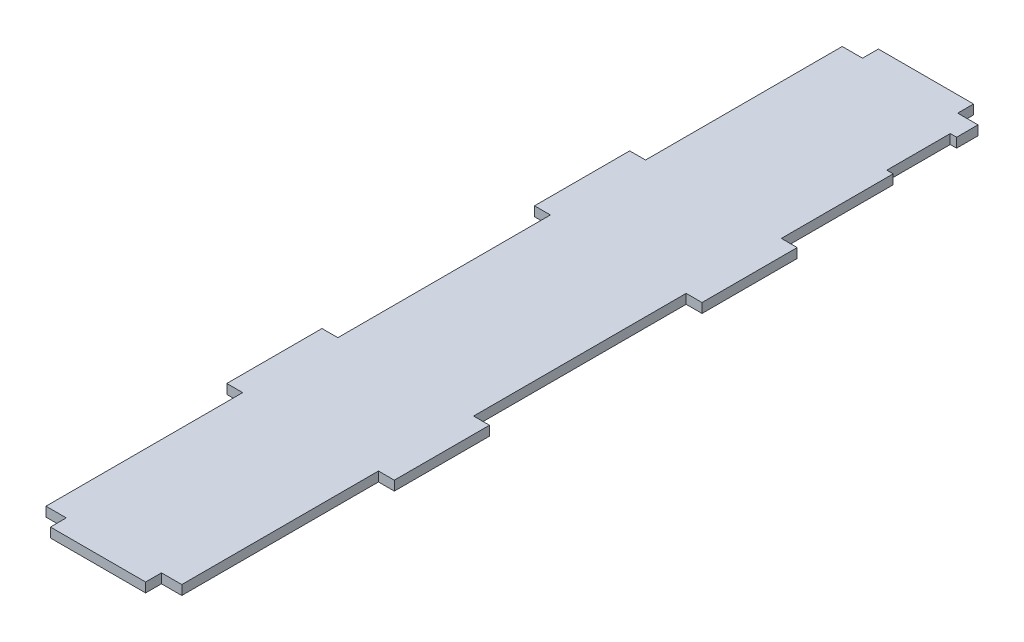
ISO-10303-21;
HEADER;
FILE_DESCRIPTION(('STEP AP214'),'2;1');
FILE_NAME('part.step','',(''),(''),'','','');
FILE_SCHEMA(('AUTOMOTIVE_DESIGN { 1 0 10303 214 1 1 1 1 }'));
ENDSEC;
DATA;
#1=APPLICATION_CONTEXT('core data for automotive mechanical design processes');
#2=APPLICATION_PROTOCOL_DEFINITION('international standard','automotive_design',2000,#1);
#3=PRODUCT_CONTEXT('',#1,'mechanical');
#4=PRODUCT('Part','Part','',(#3));
#5=PRODUCT_RELATED_PRODUCT_CATEGORY('part','',(#4));
#6=PRODUCT_DEFINITION_FORMATION('','',#4);
#7=PRODUCT_DEFINITION_CONTEXT('part definition',#1,'design');
#8=PRODUCT_DEFINITION('design','',#6,#7);
#9=PRODUCT_DEFINITION_SHAPE('','',#8);
#10=(LENGTH_UNIT() NAMED_UNIT(*) SI_UNIT(.MILLI.,.METRE.));
#11=(NAMED_UNIT(*) PLANE_ANGLE_UNIT() SI_UNIT($,.RADIAN.));
#12=(NAMED_UNIT(*) SI_UNIT($,.STERADIAN.) SOLID_ANGLE_UNIT());
#13=UNCERTAINTY_MEASURE_WITH_UNIT(LENGTH_MEASURE(1.E-05),#10,'distance_accuracy_value','');
#14=(GEOMETRIC_REPRESENTATION_CONTEXT(3) GLOBAL_UNCERTAINTY_ASSIGNED_CONTEXT((#13)) GLOBAL_UNIT_ASSIGNED_CONTEXT((#10,
#11,#12)) REPRESENTATION_CONTEXT('',''));
#15=CARTESIAN_POINT('',(0.,0.,0.));
#16=DIRECTION('',(0.,0.,1.));
#17=DIRECTION('',(1.,0.,0.));
#18=AXIS2_PLACEMENT_3D('',#15,#16,#17);
#19=CARTESIAN_POINT('',(21.4,0.,-63.5));
#20=DIRECTION('',(1.,0.,0.));
#21=DIRECTION('',(0.,0.,-1.));
#22=AXIS2_PLACEMENT_3D('',#19,#20,#21);
#23=PLANE('',#22);
#24=DIRECTION('',(0.,1.,0.));
#25=VECTOR('',#24,1.);
#26=CARTESIAN_POINT('',(21.4,0.,-118.75));
#27=LINE('',#26,#25);
#28=CARTESIAN_POINT('',(21.4,0.,-118.75));
#29=VERTEX_POINT('',#28);
#30=CARTESIAN_POINT('',(21.4,3.,-118.75));
#31=VERTEX_POINT('',#30);
#32=EDGE_CURVE('E278',#29,#31,#27,.T.);
#33=ORIENTED_EDGE('',*,*,#32,.F.);
#34=DIRECTION('',(0.,0.,-1.));
#35=VECTOR('',#34,1.);
#36=CARTESIAN_POINT('',(21.4,0.,-63.5));
#37=LINE('',#36,#35);
#38=CARTESIAN_POINT('',(21.4,0.,-125.5));
#39=VERTEX_POINT('',#38);
#40=EDGE_CURVE('E344',#29,#39,#37,.T.);
#41=ORIENTED_EDGE('',*,*,#40,.T.);
#42=DIRECTION('',(0.,1.,0.));
#43=VECTOR('',#42,1.);
#44=CARTESIAN_POINT('',(21.4,0.,-125.5));
#45=LINE('',#44,#43);
#46=CARTESIAN_POINT('',(21.4,3.,-125.5));
#47=VERTEX_POINT('',#46);
#48=EDGE_CURVE('E365',#39,#47,#45,.T.);
#49=ORIENTED_EDGE('',*,*,#48,.T.);
#50=DIRECTION('',(0.,0.,-1.));
#51=VECTOR('',#50,1.);
#52=CARTESIAN_POINT('',(21.4,3.,-63.5));
#53=LINE('',#52,#51);
#54=EDGE_CURVE('E355',#31,#47,#53,.T.);
#55=ORIENTED_EDGE('',*,*,#54,.F.);
#56=EDGE_LOOP('',(#33,#41,#49,#55));
#57=FACE_BOUND('',#56,.T.);
#58=ADVANCED_FACE('F37',(#57),#23,.T.);
#59=CARTESIAN_POINT('',(26.4,3.,130.5));
#60=DIRECTION('',(0.,0.,-1.));
#61=DIRECTION('',(-1.,0.,0.));
#62=AXIS2_PLACEMENT_3D('',#59,#60,#61);
#63=PLANE('',#62);
#64=DIRECTION('',(0.,1.,0.));
#65=VECTOR('',#64,1.);
#66=CARTESIAN_POINT('',(15.,0.,130.5));
#67=LINE('',#66,#65);
#68=CARTESIAN_POINT('',(15.,0.,130.5));
#69=VERTEX_POINT('',#68);
#70=CARTESIAN_POINT('',(15.,3.,130.5));
#71=VERTEX_POINT('',#70);
#72=EDGE_CURVE('E303',#69,#71,#67,.T.);
#73=ORIENTED_EDGE('',*,*,#72,.T.);
#74=DIRECTION('',(1.,0.,0.));
#75=VECTOR('',#74,1.);
#76=CARTESIAN_POINT('',(26.4,3.,130.5));
#77=LINE('',#76,#75);
#78=CARTESIAN_POINT('',(-15.,3.,130.5));
#79=VERTEX_POINT('',#78);
#80=EDGE_CURVE('E470',#79,#71,#77,.T.);
#81=ORIENTED_EDGE('',*,*,#80,.F.);
#82=DIRECTION('',(0.,1.,0.));
#83=VECTOR('',#82,1.);
#84=CARTESIAN_POINT('',(-15.,0.,130.5));
#85=LINE('',#84,#83);
#86=CARTESIAN_POINT('',(-15.,0.,130.5));
#87=VERTEX_POINT('',#86);
#88=EDGE_CURVE('E384',#87,#79,#85,.T.);
#89=ORIENTED_EDGE('',*,*,#88,.F.);
#90=DIRECTION('',(1.,0.,0.));
#91=VECTOR('',#90,1.);
#92=CARTESIAN_POINT('',(26.4,0.,130.5));
#93=LINE('',#92,#91);
#94=EDGE_CURVE('E479',#87,#69,#93,.T.);
#95=ORIENTED_EDGE('',*,*,#94,.T.);
#96=EDGE_LOOP('',(#73,#81,#89,#95));
#97=FACE_BOUND('',#96,.T.);
#98=ADVANCED_FACE('F565',(#97),#63,.F.);
#99=CARTESIAN_POINT('',(26.4,3.,130.5));
#100=DIRECTION('',(-1.,0.,0.));
#101=DIRECTION('',(0.,0.,1.));
#102=AXIS2_PLACEMENT_3D('',#99,#100,#101);
#103=PLANE('',#102);
#104=DIRECTION('',(0.,1.,0.));
#105=VECTOR('',#104,1.);
#106=CARTESIAN_POINT('',(26.4,0.,63.5));
#107=LINE('',#106,#105);
#108=CARTESIAN_POINT('',(26.4,0.,63.5));
#109=VERTEX_POINT('',#108);
#110=CARTESIAN_POINT('',(26.4,3.,63.5));
#111=VERTEX_POINT('',#110);
#112=EDGE_CURVE('E290',#109,#111,#107,.T.);
#113=ORIENTED_EDGE('',*,*,#112,.F.);
#114=DIRECTION('',(0.,0.,-1.));
#115=VECTOR('',#114,1.);
#116=CARTESIAN_POINT('',(26.4,0.,130.5));
#117=LINE('',#116,#115);
#118=CARTESIAN_POINT('',(26.4,0.,33.5));
#119=VERTEX_POINT('',#118);
#120=EDGE_CURVE('E483',#109,#119,#117,.T.);
#121=ORIENTED_EDGE('',*,*,#120,.T.);
#122=DIRECTION('',(0.,1.,0.));
#123=VECTOR('',#122,1.);
#124=CARTESIAN_POINT('',(26.4,0.,33.5));
#125=LINE('',#124,#123);
#126=CARTESIAN_POINT('',(26.4,3.,33.5));
#127=VERTEX_POINT('',#126);
#128=EDGE_CURVE('E295',#119,#127,#125,.T.);
#129=ORIENTED_EDGE('',*,*,#128,.T.);
#130=DIRECTION('',(0.,0.,-1.));
#131=VECTOR('',#130,1.);
#132=CARTESIAN_POINT('',(26.4,3.,130.5));
#133=LINE('',#132,#131);
#134=EDGE_CURVE('E46',#111,#127,#133,.T.);
#135=ORIENTED_EDGE('',*,*,#134,.F.);
#136=EDGE_LOOP('',(#113,#121,#129,#135));
#137=FACE_BOUND('',#136,.T.);
#138=ADVANCED_FACE('F546',(#137),#103,.F.);
#139=DIRECTION('',(0.,1.,0.));
#140=VECTOR('',#139,1.);
#141=CARTESIAN_POINT('',(26.4,0.,-33.5));
#142=LINE('',#141,#140);
#143=CARTESIAN_POINT('',(26.4,0.,-33.5));
#144=VERTEX_POINT('',#143);
#145=CARTESIAN_POINT('',(26.4,3.,-33.5));
#146=VERTEX_POINT('',#145);
#147=EDGE_CURVE('E321',#144,#146,#142,.T.);
#148=ORIENTED_EDGE('',*,*,#147,.F.);
#149=CARTESIAN_POINT('',(26.4,0.,-63.5));
#150=VERTEX_POINT('',#149);
#151=EDGE_CURVE('E481',#144,#150,#117,.T.);
#152=ORIENTED_EDGE('',*,*,#151,.T.);
#153=DIRECTION('',(0.,1.,0.));
#154=VECTOR('',#153,1.);
#155=CARTESIAN_POINT('',(26.4,0.,-63.5));
#156=LINE('',#155,#154);
#157=CARTESIAN_POINT('',(26.4,3.,-63.5));
#158=VERTEX_POINT('',#157);
#159=EDGE_CURVE('E326',#150,#158,#156,.T.);
#160=ORIENTED_EDGE('',*,*,#159,.T.);
#161=EDGE_CURVE('E473',#146,#158,#133,.T.);
#162=ORIENTED_EDGE('',*,*,#161,.F.);
#163=EDGE_LOOP('',(#148,#152,#160,#162));
#164=FACE_BOUND('',#163,.T.);
#165=ADVANCED_FACE('F532',(#164),#103,.F.);
#166=CARTESIAN_POINT('',(26.4,3.,-130.5));
#167=DIRECTION('',(0.,0.,1.));
#168=DIRECTION('',(1.,0.,0.));
#169=AXIS2_PLACEMENT_3D('',#166,#167,#168);
#170=PLANE('',#169);
#171=DIRECTION('',(0.,1.,0.));
#172=VECTOR('',#171,1.);
#173=CARTESIAN_POINT('',(15.,0.,-130.5));
#174=LINE('',#173,#172);
#175=CARTESIAN_POINT('',(15.,0.,-130.5));
#176=VERTEX_POINT('',#175);
#177=CARTESIAN_POINT('',(15.,3.,-130.5));
#178=VERTEX_POINT('',#177);
#179=EDGE_CURVE('E349',#176,#178,#174,.T.);
#180=ORIENTED_EDGE('',*,*,#179,.F.);
#181=DIRECTION('',(-1.,0.,0.));
#182=VECTOR('',#181,1.);
#183=CARTESIAN_POINT('',(26.4,0.,-130.5));
#184=LINE('',#183,#182);
#185=CARTESIAN_POINT('',(-15.,0.,-130.5));
#186=VERTEX_POINT('',#185);
#187=EDGE_CURVE('E41',#176,#186,#184,.T.);
#188=ORIENTED_EDGE('',*,*,#187,.T.);
#189=DIRECTION('',(0.,1.,0.));
#190=VECTOR('',#189,1.);
#191=CARTESIAN_POINT('',(-15.,0.,-130.5));
#192=LINE('',#191,#190);
#193=CARTESIAN_POINT('',(-15.,3.,-130.5));
#194=VERTEX_POINT('',#193);
#195=EDGE_CURVE('E306',#186,#194,#192,.T.);
#196=ORIENTED_EDGE('',*,*,#195,.T.);
#197=DIRECTION('',(-1.,0.,0.));
#198=VECTOR('',#197,1.);
#199=CARTESIAN_POINT('',(26.4,3.,-130.5));
#200=LINE('',#199,#198);
#201=EDGE_CURVE('E11',#178,#194,#200,.T.);
#202=ORIENTED_EDGE('',*,*,#201,.F.);
#203=EDGE_LOOP('',(#180,#188,#196,#202));
#204=FACE_BOUND('',#203,.T.);
#205=ADVANCED_FACE('F495',(#204),#170,.F.);
#206=CARTESIAN_POINT('',(0.,3.,0.));
#207=DIRECTION('',(0.,1.,0.));
#208=DIRECTION('',(0.,0.,1.));
#209=AXIS2_PLACEMENT_3D('',#206,#207,#208);
#210=PLANE('',#209);
#211=DIRECTION('',(-1.,0.,0.));
#212=VECTOR('',#211,1.);
#213=CARTESIAN_POINT('',(21.4,3.,-118.75));
#214=LINE('',#213,#212);
#215=CARTESIAN_POINT('',(19.4,3.,-118.75));
#216=VERTEX_POINT('',#215);
#217=EDGE_CURVE('E267',#31,#216,#214,.T.);
#218=ORIENTED_EDGE('',*,*,#217,.F.);
#219=ORIENTED_EDGE('',*,*,#54,.T.);
#220=DIRECTION('',(-1.,0.,0.));
#221=VECTOR('',#220,1.);
#222=CARTESIAN_POINT('',(21.4,3.,-125.5));
#223=LINE('',#222,#221);
#224=CARTESIAN_POINT('',(15.,3.,-125.5));
#225=VERTEX_POINT('',#224);
#226=EDGE_CURVE('E352',#47,#225,#223,.T.);
#227=ORIENTED_EDGE('',*,*,#226,.T.);
#228=DIRECTION('',(0.,0.,-1.));
#229=VECTOR('',#228,1.);
#230=CARTESIAN_POINT('',(15.,3.,-125.5));
#231=LINE('',#230,#229);
#232=EDGE_CURVE('E277',#225,#178,#231,.T.);
#233=ORIENTED_EDGE('',*,*,#232,.T.);
#234=ORIENTED_EDGE('',*,*,#201,.T.);
#235=DIRECTION('',(0.,0.,-1.));
#236=VECTOR('',#235,1.);
#237=CARTESIAN_POINT('',(-15.,3.,-125.5));
#238=LINE('',#237,#236);
#239=CARTESIAN_POINT('',(-15.,3.,-125.5));
#240=VERTEX_POINT('',#239);
#241=EDGE_CURVE('E444',#240,#194,#238,.T.);
#242=ORIENTED_EDGE('',*,*,#241,.F.);
#243=DIRECTION('',(1.,0.,0.));
#244=VECTOR('',#243,1.);
#245=CARTESIAN_POINT('',(-21.4,3.,-125.5));
#246=LINE('',#245,#244);
#247=CARTESIAN_POINT('',(-21.4,3.,-125.5));
#248=VERTEX_POINT('',#247);
#249=EDGE_CURVE('E447',#248,#240,#246,.T.);
#250=ORIENTED_EDGE('',*,*,#249,.F.);
#251=DIRECTION('',(0.,0.,-1.));
#252=VECTOR('',#251,1.);
#253=CARTESIAN_POINT('',(-21.4,3.,-63.5));
#254=LINE('',#253,#252);
#255=CARTESIAN_POINT('',(-21.4,3.,-63.5));
#256=VERTEX_POINT('',#255);
#257=EDGE_CURVE('E451',#256,#248,#254,.T.);
#258=ORIENTED_EDGE('',*,*,#257,.F.);
#259=DIRECTION('',(1.,0.,0.));
#260=VECTOR('',#259,1.);
#261=CARTESIAN_POINT('',(-26.4,3.,-63.5));
#262=LINE('',#261,#260);
#263=CARTESIAN_POINT('',(-26.4,3.,-63.5));
#264=VERTEX_POINT('',#263);
#265=EDGE_CURVE('E417',#264,#256,#262,.T.);
#266=ORIENTED_EDGE('',*,*,#265,.F.);
#267=DIRECTION('',(0.,0.,1.));
#268=VECTOR('',#267,1.);
#269=CARTESIAN_POINT('',(-26.4,3.,130.5));
#270=LINE('',#269,#268);
#271=CARTESIAN_POINT('',(-26.4,3.,-33.5));
#272=VERTEX_POINT('',#271);
#273=EDGE_CURVE('E469',#264,#272,#270,.T.);
#274=ORIENTED_EDGE('',*,*,#273,.T.);
#275=DIRECTION('',(-1.,0.,0.));
#276=VECTOR('',#275,1.);
#277=CARTESIAN_POINT('',(-26.4,3.,-33.5));
#278=LINE('',#277,#276);
#279=CARTESIAN_POINT('',(-21.4,3.,-33.5));
#280=VERTEX_POINT('',#279);
#281=EDGE_CURVE('E418',#280,#272,#278,.T.);
#282=ORIENTED_EDGE('',*,*,#281,.F.);
#283=DIRECTION('',(0.,0.,-1.));
#284=VECTOR('',#283,1.);
#285=CARTESIAN_POINT('',(-21.4,3.,33.5));
#286=LINE('',#285,#284);
#287=CARTESIAN_POINT('',(-21.4,3.,33.5));
#288=VERTEX_POINT('',#287);
#289=EDGE_CURVE('E420',#288,#280,#286,.T.);
#290=ORIENTED_EDGE('',*,*,#289,.F.);
#291=DIRECTION('',(1.,0.,0.));
#292=VECTOR('',#291,1.);
#293=CARTESIAN_POINT('',(-26.4,3.,33.5));
#294=LINE('',#293,#292);
#295=CARTESIAN_POINT('',(-26.4,3.,33.5));
#296=VERTEX_POINT('',#295);
#297=EDGE_CURVE('E389',#296,#288,#294,.T.);
#298=ORIENTED_EDGE('',*,*,#297,.F.);
#299=CARTESIAN_POINT('',(-26.4,3.,63.5));
#300=VERTEX_POINT('',#299);
#301=EDGE_CURVE('E466',#296,#300,#270,.T.);
#302=ORIENTED_EDGE('',*,*,#301,.T.);
#303=DIRECTION('',(-1.,0.,0.));
#304=VECTOR('',#303,1.);
#305=CARTESIAN_POINT('',(-26.4,3.,63.5));
#306=LINE('',#305,#304);
#307=CARTESIAN_POINT('',(-21.4,3.,63.5));
#308=VERTEX_POINT('',#307);
#309=EDGE_CURVE('E375',#308,#300,#306,.T.);
#310=ORIENTED_EDGE('',*,*,#309,.F.);
#311=DIRECTION('',(0.,0.,-1.));
#312=VECTOR('',#311,1.);
#313=CARTESIAN_POINT('',(-21.4,3.,63.5));
#314=LINE('',#313,#312);
#315=CARTESIAN_POINT('',(-21.4,3.,125.5));
#316=VERTEX_POINT('',#315);
#317=EDGE_CURVE('E392',#316,#308,#314,.T.);
#318=ORIENTED_EDGE('',*,*,#317,.F.);
#319=DIRECTION('',(-1.,0.,0.));
#320=VECTOR('',#319,1.);
#321=CARTESIAN_POINT('',(-21.4,3.,125.5));
#322=LINE('',#321,#320);
#323=CARTESIAN_POINT('',(-15.,3.,125.5));
#324=VERTEX_POINT('',#323);
#325=EDGE_CURVE('E388',#324,#316,#322,.T.);
#326=ORIENTED_EDGE('',*,*,#325,.F.);
#327=DIRECTION('',(0.,0.,-1.));
#328=VECTOR('',#327,1.);
#329=CARTESIAN_POINT('',(-15.,3.,125.5));
#330=LINE('',#329,#328);
#331=EDGE_CURVE('E385',#79,#324,#330,.T.);
#332=ORIENTED_EDGE('',*,*,#331,.F.);
#333=ORIENTED_EDGE('',*,*,#80,.T.);
#334=DIRECTION('',(0.,0.,-1.));
#335=VECTOR('',#334,1.);
#336=CARTESIAN_POINT('',(15.,3.,125.5));
#337=LINE('',#336,#335);
#338=CARTESIAN_POINT('',(15.,3.,125.5));
#339=VERTEX_POINT('',#338);
#340=EDGE_CURVE('E284',#71,#339,#337,.T.);
#341=ORIENTED_EDGE('',*,*,#340,.T.);
#342=DIRECTION('',(1.,0.,0.));
#343=VECTOR('',#342,1.);
#344=CARTESIAN_POINT('',(21.4,3.,125.5));
#345=LINE('',#344,#343);
#346=CARTESIAN_POINT('',(21.4,3.,125.5));
#347=VERTEX_POINT('',#346);
#348=EDGE_CURVE('E298',#339,#347,#345,.T.);
#349=ORIENTED_EDGE('',*,*,#348,.T.);
#350=DIRECTION('',(0.,0.,-1.));
#351=VECTOR('',#350,1.);
#352=CARTESIAN_POINT('',(21.4,3.,63.5));
#353=LINE('',#352,#351);
#354=CARTESIAN_POINT('',(21.4,3.,63.5));
#355=VERTEX_POINT('',#354);
#356=EDGE_CURVE('E294',#347,#355,#353,.T.);
#357=ORIENTED_EDGE('',*,*,#356,.T.);
#358=DIRECTION('',(1.,0.,0.));
#359=VECTOR('',#358,1.);
#360=CARTESIAN_POINT('',(26.4,3.,63.5));
#361=LINE('',#360,#359);
#362=EDGE_CURVE('E291',#355,#111,#361,.T.);
#363=ORIENTED_EDGE('',*,*,#362,.T.);
#364=ORIENTED_EDGE('',*,*,#134,.T.);
#365=DIRECTION('',(-1.,0.,0.));
#366=VECTOR('',#365,1.);
#367=CARTESIAN_POINT('',(26.4,3.,33.5));
#368=LINE('',#367,#366);
#369=CARTESIAN_POINT('',(21.4,3.,33.5));
#370=VERTEX_POINT('',#369);
#371=EDGE_CURVE('E316',#127,#370,#368,.T.);
#372=ORIENTED_EDGE('',*,*,#371,.T.);
#373=DIRECTION('',(0.,0.,-1.));
#374=VECTOR('',#373,1.);
#375=CARTESIAN_POINT('',(21.4,3.,33.5));
#376=LINE('',#375,#374);
#377=CARTESIAN_POINT('',(21.4,3.,-33.5));
#378=VERTEX_POINT('',#377);
#379=EDGE_CURVE('E325',#370,#378,#376,.T.);
#380=ORIENTED_EDGE('',*,*,#379,.T.);
#381=DIRECTION('',(1.,0.,0.));
#382=VECTOR('',#381,1.);
#383=CARTESIAN_POINT('',(26.4,3.,-33.5));
#384=LINE('',#383,#382);
#385=EDGE_CURVE('E322',#378,#146,#384,.T.);
#386=ORIENTED_EDGE('',*,*,#385,.T.);
#387=ORIENTED_EDGE('',*,*,#161,.T.);
#388=DIRECTION('',(-1.,0.,0.));
#389=VECTOR('',#388,1.);
#390=CARTESIAN_POINT('',(26.4,3.,-63.5));
#391=LINE('',#390,#389);
#392=CARTESIAN_POINT('',(21.4,3.,-63.5));
#393=VERTEX_POINT('',#392);
#394=EDGE_CURVE('E341',#158,#393,#391,.T.);
#395=ORIENTED_EDGE('',*,*,#394,.T.);
#396=CARTESIAN_POINT('',(21.4,3.,-98.7500000000001));
#397=VERTEX_POINT('',#396);
#398=EDGE_CURVE('E356',#393,#397,#53,.T.);
#399=ORIENTED_EDGE('',*,*,#398,.T.);
#400=DIRECTION('',(1.,0.,0.));
#401=VECTOR('',#400,1.);
#402=CARTESIAN_POINT('',(21.4,3.,-98.7500000000001));
#403=LINE('',#402,#401);
#404=CARTESIAN_POINT('',(19.4,3.,-98.7500000000001));
#405=VERTEX_POINT('',#404);
#406=EDGE_CURVE('E54',#405,#397,#403,.T.);
#407=ORIENTED_EDGE('',*,*,#406,.F.);
#408=DIRECTION('',(0.,0.,1.));
#409=VECTOR('',#408,1.);
#410=CARTESIAN_POINT('',(19.4,3.,-98.7500000000001));
#411=LINE('',#410,#409);
#412=EDGE_CURVE('E254',#216,#405,#411,.T.);
#413=ORIENTED_EDGE('',*,*,#412,.F.);
#414=EDGE_LOOP('',(#218,#219,#227,#233,#234,#242,#250,#258,#266,#274,#282,#290,#298,#302,#310,
#318,#326,#332,#333,#341,#349,#357,#363,#364,#372,#380,#386,#387,#395,#399,#407,#413));
#415=FACE_BOUND('',#414,.T.);
#416=ADVANCED_FACE('F509',(#415),#210,.T.);
#417=CARTESIAN_POINT('',(0.,0.,0.));
#418=DIRECTION('',(0.,1.,0.));
#419=DIRECTION('',(0.,0.,1.));
#420=AXIS2_PLACEMENT_3D('',#417,#418,#419);
#421=PLANE('',#420);
#422=ORIENTED_EDGE('',*,*,#40,.F.);
#423=DIRECTION('',(-1.,0.,0.));
#424=VECTOR('',#423,1.);
#425=CARTESIAN_POINT('',(21.4,0.,-118.75));
#426=LINE('',#425,#424);
#427=CARTESIAN_POINT('',(19.4,0.,-118.75));
#428=VERTEX_POINT('',#427);
#429=EDGE_CURVE('E256',#29,#428,#426,.T.);
#430=ORIENTED_EDGE('',*,*,#429,.T.);
#431=DIRECTION('',(0.,0.,1.));
#432=VECTOR('',#431,1.);
#433=CARTESIAN_POINT('',(19.4,0.,-98.7500000000001));
#434=LINE('',#433,#432);
#435=CARTESIAN_POINT('',(19.4,0.,-98.7500000000001));
#436=VERTEX_POINT('',#435);
#437=EDGE_CURVE('E251',#428,#436,#434,.T.);
#438=ORIENTED_EDGE('',*,*,#437,.T.);
#439=DIRECTION('',(1.,0.,0.));
#440=VECTOR('',#439,1.);
#441=CARTESIAN_POINT('',(21.4,0.,-98.7500000000001));
#442=LINE('',#441,#440);
#443=CARTESIAN_POINT('',(21.4,0.,-98.7500000000001));
#444=VERTEX_POINT('',#443);
#445=EDGE_CURVE('E259',#436,#444,#442,.T.);
#446=ORIENTED_EDGE('',*,*,#445,.T.);
#447=CARTESIAN_POINT('',(21.4,0.,-63.5));
#448=VERTEX_POINT('',#447);
#449=EDGE_CURVE('E345',#448,#444,#37,.T.);
#450=ORIENTED_EDGE('',*,*,#449,.F.);
#451=DIRECTION('',(-1.,0.,0.));
#452=VECTOR('',#451,1.);
#453=CARTESIAN_POINT('',(26.4,0.,-63.5));
#454=LINE('',#453,#452);
#455=EDGE_CURVE('E347',#150,#448,#454,.T.);
#456=ORIENTED_EDGE('',*,*,#455,.F.);
#457=ORIENTED_EDGE('',*,*,#151,.F.);
#458=DIRECTION('',(1.,0.,0.));
#459=VECTOR('',#458,1.);
#460=CARTESIAN_POINT('',(26.4,0.,-33.5));
#461=LINE('',#460,#459);
#462=CARTESIAN_POINT('',(21.4,0.,-33.5));
#463=VERTEX_POINT('',#462);
#464=EDGE_CURVE('E313',#463,#144,#461,.T.);
#465=ORIENTED_EDGE('',*,*,#464,.F.);
#466=DIRECTION('',(0.,0.,-1.));
#467=VECTOR('',#466,1.);
#468=CARTESIAN_POINT('',(21.4,0.,33.5));
#469=LINE('',#468,#467);
#470=CARTESIAN_POINT('',(21.4,0.,33.5));
#471=VERTEX_POINT('',#470);
#472=EDGE_CURVE('E315',#471,#463,#469,.T.);
#473=ORIENTED_EDGE('',*,*,#472,.F.);
#474=DIRECTION('',(-1.,0.,0.));
#475=VECTOR('',#474,1.);
#476=CARTESIAN_POINT('',(26.4,0.,33.5));
#477=LINE('',#476,#475);
#478=EDGE_CURVE('E319',#119,#471,#477,.T.);
#479=ORIENTED_EDGE('',*,*,#478,.F.);
#480=ORIENTED_EDGE('',*,*,#120,.F.);
#481=DIRECTION('',(1.,0.,0.));
#482=VECTOR('',#481,1.);
#483=CARTESIAN_POINT('',(26.4,0.,63.5));
#484=LINE('',#483,#482);
#485=CARTESIAN_POINT('',(21.4,0.,63.5));
#486=VERTEX_POINT('',#485);
#487=EDGE_CURVE('E281',#486,#109,#484,.T.);
#488=ORIENTED_EDGE('',*,*,#487,.F.);
#489=DIRECTION('',(0.,0.,-1.));
#490=VECTOR('',#489,1.);
#491=CARTESIAN_POINT('',(21.4,0.,63.5));
#492=LINE('',#491,#490);
#493=CARTESIAN_POINT('',(21.4,0.,125.5));
#494=VERTEX_POINT('',#493);
#495=EDGE_CURVE('E283',#494,#486,#492,.T.);
#496=ORIENTED_EDGE('',*,*,#495,.F.);
#497=DIRECTION('',(1.,0.,0.));
#498=VECTOR('',#497,1.);
#499=CARTESIAN_POINT('',(21.4,0.,125.5));
#500=LINE('',#499,#498);
#501=CARTESIAN_POINT('',(15.,0.,125.5));
#502=VERTEX_POINT('',#501);
#503=EDGE_CURVE('E286',#502,#494,#500,.T.);
#504=ORIENTED_EDGE('',*,*,#503,.F.);
#505=DIRECTION('',(0.,0.,-1.));
#506=VECTOR('',#505,1.);
#507=CARTESIAN_POINT('',(15.,0.,125.5));
#508=LINE('',#507,#506);
#509=EDGE_CURVE('E288',#69,#502,#508,.T.);
#510=ORIENTED_EDGE('',*,*,#509,.F.);
#511=ORIENTED_EDGE('',*,*,#94,.F.);
#512=DIRECTION('',(0.,0.,-1.));
#513=VECTOR('',#512,1.);
#514=CARTESIAN_POINT('',(-15.,0.,125.5));
#515=LINE('',#514,#513);
#516=CARTESIAN_POINT('',(-15.,0.,125.5));
#517=VERTEX_POINT('',#516);
#518=EDGE_CURVE('E371',#87,#517,#515,.T.);
#519=ORIENTED_EDGE('',*,*,#518,.T.);
#520=DIRECTION('',(-1.,0.,0.));
#521=VECTOR('',#520,1.);
#522=CARTESIAN_POINT('',(-21.4,0.,125.5));
#523=LINE('',#522,#521);
#524=CARTESIAN_POINT('',(-21.4,0.,125.5));
#525=VERTEX_POINT('',#524);
#526=EDGE_CURVE('E374',#517,#525,#523,.T.);
#527=ORIENTED_EDGE('',*,*,#526,.T.);
#528=DIRECTION('',(0.,0.,-1.));
#529=VECTOR('',#528,1.);
#530=CARTESIAN_POINT('',(-21.4,0.,63.5));
#531=LINE('',#530,#529);
#532=CARTESIAN_POINT('',(-21.4,0.,63.5));
#533=VERTEX_POINT('',#532);
#534=EDGE_CURVE('E378',#525,#533,#531,.T.);
#535=ORIENTED_EDGE('',*,*,#534,.T.);
#536=DIRECTION('',(-1.,0.,0.));
#537=VECTOR('',#536,1.);
#538=CARTESIAN_POINT('',(-26.4,0.,63.5));
#539=LINE('',#538,#537);
#540=CARTESIAN_POINT('',(-26.4,0.,63.5));
#541=VERTEX_POINT('',#540);
#542=EDGE_CURVE('E381',#533,#541,#539,.T.);
#543=ORIENTED_EDGE('',*,*,#542,.T.);
#544=DIRECTION('',(0.,0.,1.));
#545=VECTOR('',#544,1.);
#546=CARTESIAN_POINT('',(-26.4,0.,130.5));
#547=LINE('',#546,#545);
#548=CARTESIAN_POINT('',(-26.4,0.,33.5));
#549=VERTEX_POINT('',#548);
#550=EDGE_CURVE('E399',#549,#541,#547,.T.);
#551=ORIENTED_EDGE('',*,*,#550,.F.);
#552=DIRECTION('',(1.,0.,0.));
#553=VECTOR('',#552,1.);
#554=CARTESIAN_POINT('',(-26.4,0.,33.5));
#555=LINE('',#554,#553);
#556=CARTESIAN_POINT('',(-21.4,0.,33.5));
#557=VERTEX_POINT('',#556);
#558=EDGE_CURVE('E421',#549,#557,#555,.T.);
#559=ORIENTED_EDGE('',*,*,#558,.T.);
#560=DIRECTION('',(0.,0.,-1.));
#561=VECTOR('',#560,1.);
#562=CARTESIAN_POINT('',(-21.4,0.,33.5));
#563=LINE('',#562,#561);
#564=CARTESIAN_POINT('',(-21.4,0.,-33.5));
#565=VERTEX_POINT('',#564);
#566=EDGE_CURVE('E428',#557,#565,#563,.T.);
#567=ORIENTED_EDGE('',*,*,#566,.T.);
#568=DIRECTION('',(-1.,0.,0.));
#569=VECTOR('',#568,1.);
#570=CARTESIAN_POINT('',(-26.4,0.,-33.5));
#571=LINE('',#570,#569);
#572=CARTESIAN_POINT('',(-26.4,0.,-33.5));
#573=VERTEX_POINT('',#572);
#574=EDGE_CURVE('E409',#565,#573,#571,.T.);
#575=ORIENTED_EDGE('',*,*,#574,.T.);
#576=CARTESIAN_POINT('',(-26.4,0.,-63.5));
#577=VERTEX_POINT('',#576);
#578=EDGE_CURVE('E478',#577,#573,#547,.T.);
#579=ORIENTED_EDGE('',*,*,#578,.F.);
#580=DIRECTION('',(1.,0.,0.));
#581=VECTOR('',#580,1.);
#582=CARTESIAN_POINT('',(-26.4,0.,-63.5));
#583=LINE('',#582,#581);
#584=CARTESIAN_POINT('',(-21.4,0.,-63.5));
#585=VERTEX_POINT('',#584);
#586=EDGE_CURVE('E448',#577,#585,#583,.T.);
#587=ORIENTED_EDGE('',*,*,#586,.T.);
#588=DIRECTION('',(0.,0.,-1.));
#589=VECTOR('',#588,1.);
#590=CARTESIAN_POINT('',(-21.4,0.,-63.5));
#591=LINE('',#590,#589);
#592=CARTESIAN_POINT('',(-21.4,0.,-125.5));
#593=VERTEX_POINT('',#592);
#594=EDGE_CURVE('E461',#585,#593,#591,.T.);
#595=ORIENTED_EDGE('',*,*,#594,.T.);
#596=DIRECTION('',(1.,0.,0.));
#597=VECTOR('',#596,1.);
#598=CARTESIAN_POINT('',(-21.4,0.,-125.5));
#599=LINE('',#598,#597);
#600=CARTESIAN_POINT('',(-15.,0.,-125.5));
#601=VERTEX_POINT('',#600);
#602=EDGE_CURVE('E458',#593,#601,#599,.T.);
#603=ORIENTED_EDGE('',*,*,#602,.T.);
#604=DIRECTION('',(0.,0.,-1.));
#605=VECTOR('',#604,1.);
#606=CARTESIAN_POINT('',(-15.,0.,-125.5));
#607=LINE('',#606,#605);
#608=EDGE_CURVE('E435',#601,#186,#607,.T.);
#609=ORIENTED_EDGE('',*,*,#608,.T.);
#610=ORIENTED_EDGE('',*,*,#187,.F.);
#611=DIRECTION('',(0.,0.,-1.));
#612=VECTOR('',#611,1.);
#613=CARTESIAN_POINT('',(15.,0.,-125.5));
#614=LINE('',#613,#612);
#615=CARTESIAN_POINT('',(15.,0.,-125.5));
#616=VERTEX_POINT('',#615);
#617=EDGE_CURVE('E338',#616,#176,#614,.T.);
#618=ORIENTED_EDGE('',*,*,#617,.F.);
#619=DIRECTION('',(-1.,0.,0.));
#620=VECTOR('',#619,1.);
#621=CARTESIAN_POINT('',(21.4,0.,-125.5));
#622=LINE('',#621,#620);
#623=EDGE_CURVE('E340',#39,#616,#622,.T.);
#624=ORIENTED_EDGE('',*,*,#623,.F.);
#625=EDGE_LOOP('',(#422,#430,#438,#446,#450,#456,#457,#465,#473,#479,#480,#488,#496,#504,#510,
#511,#519,#527,#535,#543,#551,#559,#567,#575,#579,#587,#595,#603,#609,#610,#618,#624));
#626=FACE_BOUND('',#625,.T.);
#627=ADVANCED_FACE('F266',(#626),#421,.F.);
#628=CARTESIAN_POINT('',(-26.4,3.,130.5));
#629=DIRECTION('',(1.,0.,0.));
#630=DIRECTION('',(0.,0.,-1.));
#631=AXIS2_PLACEMENT_3D('',#628,#629,#630);
#632=PLANE('',#631);
#633=ORIENTED_EDGE('',*,*,#578,.T.);
#634=DIRECTION('',(0.,1.,0.));
#635=VECTOR('',#634,1.);
#636=CARTESIAN_POINT('',(-26.4,0.,-33.5));
#637=LINE('',#636,#635);
#638=EDGE_CURVE('E414',#573,#272,#637,.T.);
#639=ORIENTED_EDGE('',*,*,#638,.T.);
#640=ORIENTED_EDGE('',*,*,#273,.F.);
#641=DIRECTION('',(0.,1.,0.));
#642=VECTOR('',#641,1.);
#643=CARTESIAN_POINT('',(-26.4,0.,-63.5));
#644=LINE('',#643,#642);
#645=EDGE_CURVE('E433',#577,#264,#644,.T.);
#646=ORIENTED_EDGE('',*,*,#645,.F.);
#647=EDGE_LOOP('',(#633,#639,#640,#646));
#648=FACE_BOUND('',#647,.T.);
#649=ADVANCED_FACE('F602',(#648),#632,.F.);
#650=ORIENTED_EDGE('',*,*,#550,.T.);
#651=DIRECTION('',(0.,1.,0.));
#652=VECTOR('',#651,1.);
#653=CARTESIAN_POINT('',(-26.4,0.,63.5));
#654=LINE('',#653,#652);
#655=EDGE_CURVE('E396',#541,#300,#654,.T.);
#656=ORIENTED_EDGE('',*,*,#655,.T.);
#657=ORIENTED_EDGE('',*,*,#301,.F.);
#658=DIRECTION('',(0.,1.,0.));
#659=VECTOR('',#658,1.);
#660=CARTESIAN_POINT('',(-26.4,0.,33.5));
#661=LINE('',#660,#659);
#662=EDGE_CURVE('E407',#549,#296,#661,.T.);
#663=ORIENTED_EDGE('',*,*,#662,.F.);
#664=EDGE_LOOP('',(#650,#656,#657,#663));
#665=FACE_BOUND('',#664,.T.);
#666=ADVANCED_FACE('F39',(#665),#632,.F.);
#667=CARTESIAN_POINT('',(-15.,0.,-125.5));
#668=DIRECTION('',(1.,0.,0.));
#669=DIRECTION('',(0.,0.,-1.));
#670=AXIS2_PLACEMENT_3D('',#667,#668,#669);
#671=PLANE('',#670);
#672=ORIENTED_EDGE('',*,*,#241,.T.);
#673=ORIENTED_EDGE('',*,*,#195,.F.);
#674=ORIENTED_EDGE('',*,*,#608,.F.);
#675=DIRECTION('',(0.,1.,0.));
#676=VECTOR('',#675,1.);
#677=CARTESIAN_POINT('',(-15.,0.,-125.5));
#678=LINE('',#677,#676);
#679=EDGE_CURVE('E440',#601,#240,#678,.T.);
#680=ORIENTED_EDGE('',*,*,#679,.T.);
#681=EDGE_LOOP('',(#672,#673,#674,#680));
#682=FACE_BOUND('',#681,.T.);
#683=ADVANCED_FACE('F500',(#682),#671,.F.);
#684=CARTESIAN_POINT('',(-21.4,0.,-125.5));
#685=DIRECTION('',(0.,0.,1.));
#686=DIRECTION('',(1.,0.,0.));
#687=AXIS2_PLACEMENT_3D('',#684,#685,#686);
#688=PLANE('',#687);
#689=ORIENTED_EDGE('',*,*,#249,.T.);
#690=ORIENTED_EDGE('',*,*,#679,.F.);
#691=ORIENTED_EDGE('',*,*,#602,.F.);
#692=DIRECTION('',(0.,1.,0.));
#693=VECTOR('',#692,1.);
#694=CARTESIAN_POINT('',(-21.4,0.,-125.5));
#695=LINE('',#694,#693);
#696=EDGE_CURVE('E438',#593,#248,#695,.T.);
#697=ORIENTED_EDGE('',*,*,#696,.T.);
#698=EDGE_LOOP('',(#689,#690,#691,#697));
#699=FACE_BOUND('',#698,.T.);
#700=ADVANCED_FACE('F504',(#699),#688,.F.);
#701=CARTESIAN_POINT('',(-21.4,0.,-63.5));
#702=DIRECTION('',(1.,0.,0.));
#703=DIRECTION('',(0.,0.,-1.));
#704=AXIS2_PLACEMENT_3D('',#701,#702,#703);
#705=PLANE('',#704);
#706=ORIENTED_EDGE('',*,*,#257,.T.);
#707=ORIENTED_EDGE('',*,*,#696,.F.);
#708=ORIENTED_EDGE('',*,*,#594,.F.);
#709=DIRECTION('',(0.,1.,0.));
#710=VECTOR('',#709,1.);
#711=CARTESIAN_POINT('',(-21.4,0.,-63.5));
#712=LINE('',#711,#710);
#713=EDGE_CURVE('E436',#585,#256,#712,.T.);
#714=ORIENTED_EDGE('',*,*,#713,.T.);
#715=EDGE_LOOP('',(#706,#707,#708,#714));
#716=FACE_BOUND('',#715,.T.);
#717=ADVANCED_FACE('F609',(#716),#705,.F.);
#718=CARTESIAN_POINT('',(-26.4,0.,-63.5));
#719=DIRECTION('',(0.,0.,1.));
#720=DIRECTION('',(1.,0.,0.));
#721=AXIS2_PLACEMENT_3D('',#718,#719,#720);
#722=PLANE('',#721);
#723=ORIENTED_EDGE('',*,*,#265,.T.);
#724=ORIENTED_EDGE('',*,*,#713,.F.);
#725=ORIENTED_EDGE('',*,*,#586,.F.);
#726=ORIENTED_EDGE('',*,*,#645,.T.);
#727=EDGE_LOOP('',(#723,#724,#725,#726));
#728=FACE_BOUND('',#727,.T.);
#729=ADVANCED_FACE('F607',(#728),#722,.F.);
#730=CARTESIAN_POINT('',(-26.4,0.,-33.5));
#731=DIRECTION('',(0.,0.,-1.));
#732=DIRECTION('',(-1.,0.,0.));
#733=AXIS2_PLACEMENT_3D('',#730,#731,#732);
#734=PLANE('',#733);
#735=ORIENTED_EDGE('',*,*,#281,.T.);
#736=ORIENTED_EDGE('',*,*,#638,.F.);
#737=ORIENTED_EDGE('',*,*,#574,.F.);
#738=DIRECTION('',(0.,1.,0.));
#739=VECTOR('',#738,1.);
#740=CARTESIAN_POINT('',(-21.4,0.,-33.5));
#741=LINE('',#740,#739);
#742=EDGE_CURVE('E412',#565,#280,#741,.T.);
#743=ORIENTED_EDGE('',*,*,#742,.T.);
#744=EDGE_LOOP('',(#735,#736,#737,#743));
#745=FACE_BOUND('',#744,.T.);
#746=ADVANCED_FACE('F598',(#745),#734,.F.);
#747=CARTESIAN_POINT('',(-21.4,0.,33.5));
#748=DIRECTION('',(1.,0.,0.));
#749=DIRECTION('',(0.,0.,-1.));
#750=AXIS2_PLACEMENT_3D('',#747,#748,#749);
#751=PLANE('',#750);
#752=ORIENTED_EDGE('',*,*,#289,.T.);
#753=ORIENTED_EDGE('',*,*,#742,.F.);
#754=ORIENTED_EDGE('',*,*,#566,.F.);
#755=DIRECTION('',(0.,1.,0.));
#756=VECTOR('',#755,1.);
#757=CARTESIAN_POINT('',(-21.4,0.,33.5));
#758=LINE('',#757,#756);
#759=EDGE_CURVE('E410',#557,#288,#758,.T.);
#760=ORIENTED_EDGE('',*,*,#759,.T.);
#761=EDGE_LOOP('',(#752,#753,#754,#760));
#762=FACE_BOUND('',#761,.T.);
#763=ADVANCED_FACE('F596',(#762),#751,.F.);
#764=CARTESIAN_POINT('',(-26.4,0.,33.5));
#765=DIRECTION('',(0.,0.,1.));
#766=DIRECTION('',(1.,0.,0.));
#767=AXIS2_PLACEMENT_3D('',#764,#765,#766);
#768=PLANE('',#767);
#769=ORIENTED_EDGE('',*,*,#297,.T.);
#770=ORIENTED_EDGE('',*,*,#759,.F.);
#771=ORIENTED_EDGE('',*,*,#558,.F.);
#772=ORIENTED_EDGE('',*,*,#662,.T.);
#773=EDGE_LOOP('',(#769,#770,#771,#772));
#774=FACE_BOUND('',#773,.T.);
#775=ADVANCED_FACE('F591',(#774),#768,.F.);
#776=CARTESIAN_POINT('',(-26.4,0.,63.5));
#777=DIRECTION('',(0.,0.,-1.));
#778=DIRECTION('',(-1.,0.,0.));
#779=AXIS2_PLACEMENT_3D('',#776,#777,#778);
#780=PLANE('',#779);
#781=ORIENTED_EDGE('',*,*,#309,.T.);
#782=ORIENTED_EDGE('',*,*,#655,.F.);
#783=ORIENTED_EDGE('',*,*,#542,.F.);
#784=DIRECTION('',(0.,1.,0.));
#785=VECTOR('',#784,1.);
#786=CARTESIAN_POINT('',(-21.4,0.,63.5));
#787=LINE('',#786,#785);
#788=EDGE_CURVE('E400',#533,#308,#787,.T.);
#789=ORIENTED_EDGE('',*,*,#788,.T.);
#790=EDGE_LOOP('',(#781,#782,#783,#789));
#791=FACE_BOUND('',#790,.T.);
#792=ADVANCED_FACE('F582',(#791),#780,.F.);
#793=CARTESIAN_POINT('',(-21.4,0.,63.5));
#794=DIRECTION('',(1.,0.,0.));
#795=DIRECTION('',(0.,0.,-1.));
#796=AXIS2_PLACEMENT_3D('',#793,#794,#795);
#797=PLANE('',#796);
#798=ORIENTED_EDGE('',*,*,#317,.T.);
#799=ORIENTED_EDGE('',*,*,#788,.F.);
#800=ORIENTED_EDGE('',*,*,#534,.F.);
#801=DIRECTION('',(0.,1.,0.));
#802=VECTOR('',#801,1.);
#803=CARTESIAN_POINT('',(-21.4,0.,125.5));
#804=LINE('',#803,#802);
#805=EDGE_CURVE('E402',#525,#316,#804,.T.);
#806=ORIENTED_EDGE('',*,*,#805,.T.);
#807=EDGE_LOOP('',(#798,#799,#800,#806));
#808=FACE_BOUND('',#807,.T.);
#809=ADVANCED_FACE('F580',(#808),#797,.F.);
#810=CARTESIAN_POINT('',(-21.4,0.,125.5));
#811=DIRECTION('',(0.,0.,-1.));
#812=DIRECTION('',(-1.,0.,0.));
#813=AXIS2_PLACEMENT_3D('',#810,#811,#812);
#814=PLANE('',#813);
#815=ORIENTED_EDGE('',*,*,#325,.T.);
#816=ORIENTED_EDGE('',*,*,#805,.F.);
#817=ORIENTED_EDGE('',*,*,#526,.F.);
#818=DIRECTION('',(0.,1.,0.));
#819=VECTOR('',#818,1.);
#820=CARTESIAN_POINT('',(-15.,0.,125.5));
#821=LINE('',#820,#819);
#822=EDGE_CURVE('E404',#517,#324,#821,.T.);
#823=ORIENTED_EDGE('',*,*,#822,.T.);
#824=EDGE_LOOP('',(#815,#816,#817,#823));
#825=FACE_BOUND('',#824,.T.);
#826=ADVANCED_FACE('F575',(#825),#814,.F.);
#827=CARTESIAN_POINT('',(-15.,0.,125.5));
#828=DIRECTION('',(1.,0.,0.));
#829=DIRECTION('',(0.,0.,-1.));
#830=AXIS2_PLACEMENT_3D('',#827,#828,#829);
#831=PLANE('',#830);
#832=ORIENTED_EDGE('',*,*,#331,.T.);
#833=ORIENTED_EDGE('',*,*,#822,.F.);
#834=ORIENTED_EDGE('',*,*,#518,.F.);
#835=ORIENTED_EDGE('',*,*,#88,.T.);
#836=EDGE_LOOP('',(#832,#833,#834,#835));
#837=FACE_BOUND('',#836,.T.);
#838=ADVANCED_FACE('F569',(#837),#831,.F.);
#839=CARTESIAN_POINT('',(26.4,0.,-63.5));
#840=DIRECTION('',(0.,0.,-1.));
#841=DIRECTION('',(-1.,0.,0.));
#842=AXIS2_PLACEMENT_3D('',#839,#840,#841);
#843=PLANE('',#842);
#844=ORIENTED_EDGE('',*,*,#394,.F.);
#845=ORIENTED_EDGE('',*,*,#159,.F.);
#846=ORIENTED_EDGE('',*,*,#455,.T.);
#847=DIRECTION('',(0.,1.,0.));
#848=VECTOR('',#847,1.);
#849=CARTESIAN_POINT('',(21.4,0.,-63.5));
#850=LINE('',#849,#848);
#851=EDGE_CURVE('E363',#448,#393,#850,.T.);
#852=ORIENTED_EDGE('',*,*,#851,.T.);
#853=EDGE_LOOP('',(#844,#845,#846,#852));
#854=FACE_BOUND('',#853,.T.);
#855=ADVANCED_FACE('F530',(#854),#843,.T.);
#856=DIRECTION('',(0.,1.,0.));
#857=VECTOR('',#856,1.);
#858=CARTESIAN_POINT('',(21.4,0.,-98.7500000000001));
#859=LINE('',#858,#857);
#860=EDGE_CURVE('E255',#444,#397,#859,.T.);
#861=ORIENTED_EDGE('',*,*,#860,.T.);
#862=ORIENTED_EDGE('',*,*,#398,.F.);
#863=ORIENTED_EDGE('',*,*,#851,.F.);
#864=ORIENTED_EDGE('',*,*,#449,.T.);
#865=EDGE_LOOP('',(#861,#862,#863,#864));
#866=FACE_BOUND('',#865,.T.);
#867=ADVANCED_FACE('F526',(#866),#23,.T.);
#868=CARTESIAN_POINT('',(21.4,0.,-125.5));
#869=DIRECTION('',(0.,0.,-1.));
#870=DIRECTION('',(-1.,0.,0.));
#871=AXIS2_PLACEMENT_3D('',#868,#869,#870);
#872=PLANE('',#871);
#873=ORIENTED_EDGE('',*,*,#226,.F.);
#874=ORIENTED_EDGE('',*,*,#48,.F.);
#875=ORIENTED_EDGE('',*,*,#623,.T.);
#876=DIRECTION('',(0.,1.,0.));
#877=VECTOR('',#876,1.);
#878=CARTESIAN_POINT('',(15.,0.,-125.5));
#879=LINE('',#878,#877);
#880=EDGE_CURVE('E368',#616,#225,#879,.T.);
#881=ORIENTED_EDGE('',*,*,#880,.T.);
#882=EDGE_LOOP('',(#873,#874,#875,#881));
#883=FACE_BOUND('',#882,.T.);
#884=ADVANCED_FACE('F517',(#883),#872,.T.);
#885=CARTESIAN_POINT('',(15.,0.,-125.5));
#886=DIRECTION('',(1.,0.,0.));
#887=DIRECTION('',(0.,0.,-1.));
#888=AXIS2_PLACEMENT_3D('',#885,#886,#887);
#889=PLANE('',#888);
#890=ORIENTED_EDGE('',*,*,#232,.F.);
#891=ORIENTED_EDGE('',*,*,#880,.F.);
#892=ORIENTED_EDGE('',*,*,#617,.T.);
#893=ORIENTED_EDGE('',*,*,#179,.T.);
#894=EDGE_LOOP('',(#890,#891,#892,#893));
#895=FACE_BOUND('',#894,.T.);
#896=ADVANCED_FACE('F513',(#895),#889,.T.);
#897=CARTESIAN_POINT('',(26.4,0.,33.5));
#898=DIRECTION('',(0.,0.,-1.));
#899=DIRECTION('',(-1.,0.,0.));
#900=AXIS2_PLACEMENT_3D('',#897,#898,#899);
#901=PLANE('',#900);
#902=ORIENTED_EDGE('',*,*,#371,.F.);
#903=ORIENTED_EDGE('',*,*,#128,.F.);
#904=ORIENTED_EDGE('',*,*,#478,.T.);
#905=DIRECTION('',(0.,1.,0.));
#906=VECTOR('',#905,1.);
#907=CARTESIAN_POINT('',(21.4,0.,33.5));
#908=LINE('',#907,#906);
#909=EDGE_CURVE('E333',#471,#370,#908,.T.);
#910=ORIENTED_EDGE('',*,*,#909,.T.);
#911=EDGE_LOOP('',(#902,#903,#904,#910));
#912=FACE_BOUND('',#911,.T.);
#913=ADVANCED_FACE('F543',(#912),#901,.T.);
#914=CARTESIAN_POINT('',(21.4,0.,33.5));
#915=DIRECTION('',(1.,0.,0.));
#916=DIRECTION('',(0.,0.,-1.));
#917=AXIS2_PLACEMENT_3D('',#914,#915,#916);
#918=PLANE('',#917);
#919=ORIENTED_EDGE('',*,*,#379,.F.);
#920=ORIENTED_EDGE('',*,*,#909,.F.);
#921=ORIENTED_EDGE('',*,*,#472,.T.);
#922=DIRECTION('',(0.,1.,0.));
#923=VECTOR('',#922,1.);
#924=CARTESIAN_POINT('',(21.4,0.,-33.5));
#925=LINE('',#924,#923);
#926=EDGE_CURVE('E335',#463,#378,#925,.T.);
#927=ORIENTED_EDGE('',*,*,#926,.T.);
#928=EDGE_LOOP('',(#919,#920,#921,#927));
#929=FACE_BOUND('',#928,.T.);
#930=ADVANCED_FACE('F541',(#929),#918,.T.);
#931=CARTESIAN_POINT('',(26.4,0.,-33.5));
#932=DIRECTION('',(0.,0.,1.));
#933=DIRECTION('',(1.,0.,0.));
#934=AXIS2_PLACEMENT_3D('',#931,#932,#933);
#935=PLANE('',#934);
#936=ORIENTED_EDGE('',*,*,#385,.F.);
#937=ORIENTED_EDGE('',*,*,#926,.F.);
#938=ORIENTED_EDGE('',*,*,#464,.T.);
#939=ORIENTED_EDGE('',*,*,#147,.T.);
#940=EDGE_LOOP('',(#936,#937,#938,#939));
#941=FACE_BOUND('',#940,.T.);
#942=ADVANCED_FACE('F536',(#941),#935,.T.);
#943=CARTESIAN_POINT('',(15.,0.,125.5));
#944=DIRECTION('',(1.,0.,0.));
#945=DIRECTION('',(0.,0.,-1.));
#946=AXIS2_PLACEMENT_3D('',#943,#944,#945);
#947=PLANE('',#946);
#948=ORIENTED_EDGE('',*,*,#340,.F.);
#949=ORIENTED_EDGE('',*,*,#72,.F.);
#950=ORIENTED_EDGE('',*,*,#509,.T.);
#951=DIRECTION('',(0.,1.,0.));
#952=VECTOR('',#951,1.);
#953=CARTESIAN_POINT('',(15.,0.,125.5));
#954=LINE('',#953,#952);
#955=EDGE_CURVE('E307',#502,#339,#954,.T.);
#956=ORIENTED_EDGE('',*,*,#955,.T.);
#957=EDGE_LOOP('',(#948,#949,#950,#956));
#958=FACE_BOUND('',#957,.T.);
#959=ADVANCED_FACE('F561',(#958),#947,.T.);
#960=CARTESIAN_POINT('',(21.4,0.,125.5));
#961=DIRECTION('',(0.,0.,1.));
#962=DIRECTION('',(1.,0.,0.));
#963=AXIS2_PLACEMENT_3D('',#960,#961,#962);
#964=PLANE('',#963);
#965=ORIENTED_EDGE('',*,*,#348,.F.);
#966=ORIENTED_EDGE('',*,*,#955,.F.);
#967=ORIENTED_EDGE('',*,*,#503,.T.);
#968=DIRECTION('',(0.,1.,0.));
#969=VECTOR('',#968,1.);
#970=CARTESIAN_POINT('',(21.4,0.,125.5));
#971=LINE('',#970,#969);
#972=EDGE_CURVE('E309',#494,#347,#971,.T.);
#973=ORIENTED_EDGE('',*,*,#972,.T.);
#974=EDGE_LOOP('',(#965,#966,#967,#973));
#975=FACE_BOUND('',#974,.T.);
#976=ADVANCED_FACE('F558',(#975),#964,.T.);
#977=CARTESIAN_POINT('',(21.4,0.,63.5));
#978=DIRECTION('',(1.,0.,0.));
#979=DIRECTION('',(0.,0.,-1.));
#980=AXIS2_PLACEMENT_3D('',#977,#978,#979);
#981=PLANE('',#980);
#982=ORIENTED_EDGE('',*,*,#356,.F.);
#983=ORIENTED_EDGE('',*,*,#972,.F.);
#984=ORIENTED_EDGE('',*,*,#495,.T.);
#985=DIRECTION('',(0.,1.,0.));
#986=VECTOR('',#985,1.);
#987=CARTESIAN_POINT('',(21.4,0.,63.5));
#988=LINE('',#987,#986);
#989=EDGE_CURVE('E62',#486,#355,#988,.T.);
#990=ORIENTED_EDGE('',*,*,#989,.T.);
#991=EDGE_LOOP('',(#982,#983,#984,#990));
#992=FACE_BOUND('',#991,.T.);
#993=ADVANCED_FACE('F555',(#992),#981,.T.);
#994=CARTESIAN_POINT('',(26.4,0.,63.5));
#995=DIRECTION('',(0.,0.,1.));
#996=DIRECTION('',(1.,0.,0.));
#997=AXIS2_PLACEMENT_3D('',#994,#995,#996);
#998=PLANE('',#997);
#999=ORIENTED_EDGE('',*,*,#362,.F.);
#1000=ORIENTED_EDGE('',*,*,#989,.F.);
#1001=ORIENTED_EDGE('',*,*,#487,.T.);
#1002=ORIENTED_EDGE('',*,*,#112,.T.);
#1003=EDGE_LOOP('',(#999,#1000,#1001,#1002));
#1004=FACE_BOUND('',#1003,.T.);
#1005=ADVANCED_FACE('F548',(#1004),#998,.T.);
#1006=CARTESIAN_POINT('',(19.4,0.,-98.7500000000001));
#1007=DIRECTION('',(-1.,0.,0.));
#1008=DIRECTION('',(0.,0.,1.));
#1009=AXIS2_PLACEMENT_3D('',#1006,#1007,#1008);
#1010=PLANE('',#1009);
#1011=ORIENTED_EDGE('',*,*,#412,.T.);
#1012=DIRECTION('',(0.,1.,0.));
#1013=VECTOR('',#1012,1.);
#1014=CARTESIAN_POINT('',(19.4,0.,-98.7500000000001));
#1015=LINE('',#1014,#1013);
#1016=EDGE_CURVE('E247',#436,#405,#1015,.T.);
#1017=ORIENTED_EDGE('',*,*,#1016,.F.);
#1018=ORIENTED_EDGE('',*,*,#437,.F.);
#1019=DIRECTION('',(0.,1.,0.));
#1020=VECTOR('',#1019,1.);
#1021=CARTESIAN_POINT('',(19.4,0.,-118.75));
#1022=LINE('',#1021,#1020);
#1023=EDGE_CURVE('E275',#428,#216,#1022,.T.);
#1024=ORIENTED_EDGE('',*,*,#1023,.T.);
#1025=EDGE_LOOP('',(#1011,#1017,#1018,#1024));
#1026=FACE_BOUND('',#1025,.T.);
#1027=ADVANCED_FACE('F249',(#1026),#1010,.F.);
#1028=CARTESIAN_POINT('',(21.4,0.,-118.75));
#1029=DIRECTION('',(0.,0.,-1.));
#1030=DIRECTION('',(-1.,0.,0.));
#1031=AXIS2_PLACEMENT_3D('',#1028,#1029,#1030);
#1032=PLANE('',#1031);
#1033=ORIENTED_EDGE('',*,*,#217,.T.);
#1034=ORIENTED_EDGE('',*,*,#1023,.F.);
#1035=ORIENTED_EDGE('',*,*,#429,.F.);
#1036=ORIENTED_EDGE('',*,*,#32,.T.);
#1037=EDGE_LOOP('',(#1033,#1034,#1035,#1036));
#1038=FACE_BOUND('',#1037,.T.);
#1039=ADVANCED_FACE('F522',(#1038),#1032,.F.);
#1040=CARTESIAN_POINT('',(21.4,0.,-98.7500000000001));
#1041=DIRECTION('',(0.,0.,1.));
#1042=DIRECTION('',(1.,0.,0.));
#1043=AXIS2_PLACEMENT_3D('',#1040,#1041,#1042);
#1044=PLANE('',#1043);
#1045=ORIENTED_EDGE('',*,*,#406,.T.);
#1046=ORIENTED_EDGE('',*,*,#860,.F.);
#1047=ORIENTED_EDGE('',*,*,#445,.F.);
#1048=ORIENTED_EDGE('',*,*,#1016,.T.);
#1049=EDGE_LOOP('',(#1045,#1046,#1047,#1048));
#1050=FACE_BOUND('',#1049,.T.);
#1051=ADVANCED_FACE('F260',(#1050),#1044,.F.);
#1052=CLOSED_SHELL('',(#58,#98,#138,#165,#205,#416,#627,#649,#666,#683,#700,#717,#729,#746,#763,
#775,#792,#809,#826,#838,#855,#867,#884,#896,#913,#930,#942,#959,#976,#993,#1005,#1027,#1039,#1051));
#1053=MANIFOLD_SOLID_BREP('B2',#1052);
#1054=ADVANCED_BREP_SHAPE_REPRESENTATION('',(#18,#1053),#14);
#1055=SHAPE_DEFINITION_REPRESENTATION(#9,#1054);
ENDSEC;
END-ISO-10303-21;
